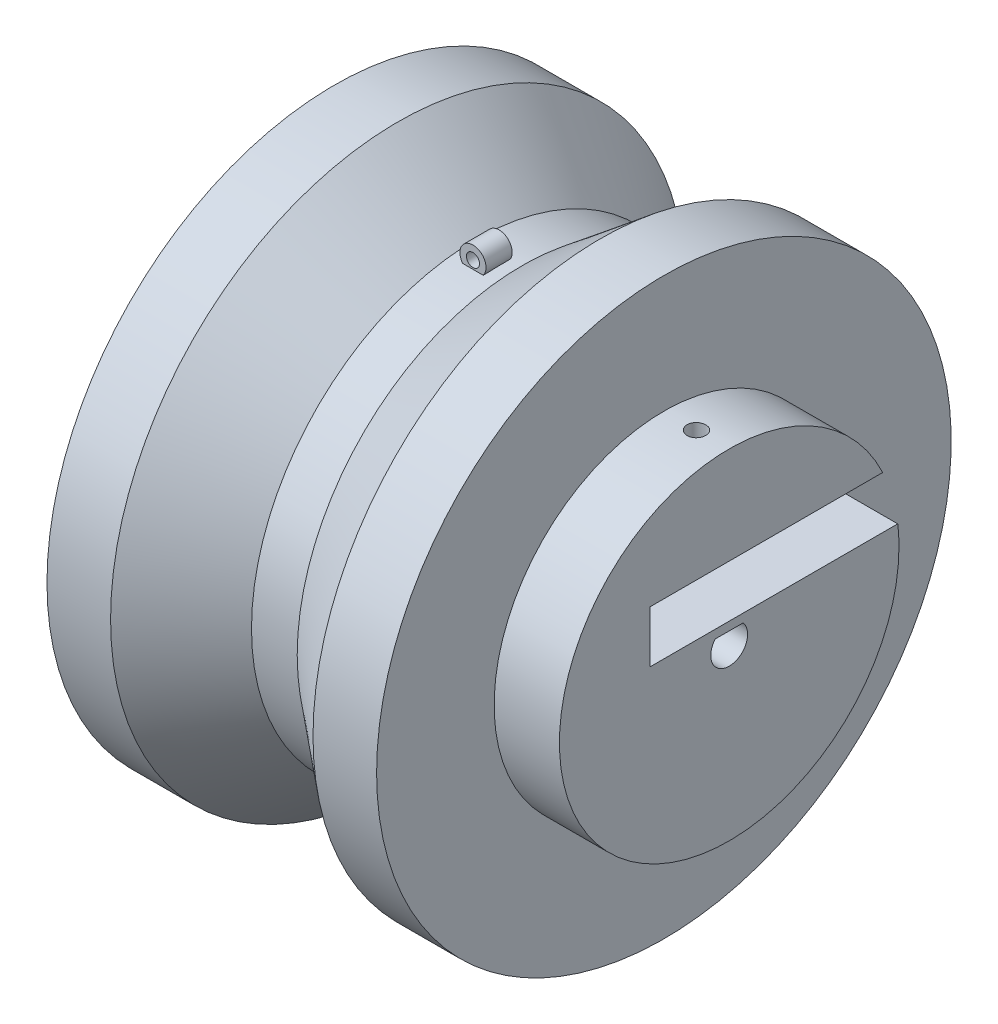
ISO-10303-21;
HEADER;
FILE_DESCRIPTION(('STEP AP214'),'2;1');
FILE_NAME('part.step','',(''),(''),'','','');
FILE_SCHEMA(('AUTOMOTIVE_DESIGN { 1 0 10303 214 1 1 1 1 }'));
ENDSEC;
DATA;
#1=APPLICATION_CONTEXT('core data for automotive mechanical design processes');
#2=APPLICATION_PROTOCOL_DEFINITION('international standard','automotive_design',2000,#1);
#3=PRODUCT_CONTEXT('',#1,'mechanical');
#4=PRODUCT('Part','Part','',(#3));
#5=PRODUCT_RELATED_PRODUCT_CATEGORY('part','',(#4));
#6=PRODUCT_DEFINITION_FORMATION('','',#4);
#7=PRODUCT_DEFINITION_CONTEXT('part definition',#1,'design');
#8=PRODUCT_DEFINITION('design','',#6,#7);
#9=PRODUCT_DEFINITION_SHAPE('','',#8);
#10=(LENGTH_UNIT() NAMED_UNIT(*) SI_UNIT(.MILLI.,.METRE.));
#11=(NAMED_UNIT(*) PLANE_ANGLE_UNIT() SI_UNIT($,.RADIAN.));
#12=(NAMED_UNIT(*) SI_UNIT($,.STERADIAN.) SOLID_ANGLE_UNIT());
#13=UNCERTAINTY_MEASURE_WITH_UNIT(LENGTH_MEASURE(1.E-05),#10,'distance_accuracy_value','');
#14=(GEOMETRIC_REPRESENTATION_CONTEXT(3) GLOBAL_UNCERTAINTY_ASSIGNED_CONTEXT((#13)) GLOBAL_UNIT_ASSIGNED_CONTEXT((#10,
#11,#12)) REPRESENTATION_CONTEXT('',''));
#15=CARTESIAN_POINT('',(0.,0.,0.));
#16=DIRECTION('',(0.,0.,1.));
#17=DIRECTION('',(1.,0.,0.));
#18=AXIS2_PLACEMENT_3D('',#15,#16,#17);
#19=CARTESIAN_POINT('',(-743.156397809563,0.,0.));
#20=DIRECTION('',(-1.,0.,0.));
#21=DIRECTION('',(0.,0.,1.));
#22=AXIS2_PLACEMENT_3D('',#19,#20,#21);
#23=CYLINDRICAL_SURFACE('',#22,34.4188584474886);
#24=CARTESIAN_POINT('',(28.74,0.,0.));
#25=DIRECTION('',(-1.,0.,0.));
#26=DIRECTION('',(0.,0.,1.));
#27=AXIS2_PLACEMENT_3D('',#24,#25,#26);
#28=CIRCLE('',#27,34.4188584474886);
#29=CARTESIAN_POINT('',(28.74,0.,34.4188584474886));
#30=VERTEX_POINT('',#29);
#31=EDGE_CURVE('E344',#30,#30,#28,.T.);
#32=ORIENTED_EDGE('',*,*,#31,.T.);
#33=EDGE_LOOP('',(#32));
#34=FACE_BOUND('',#33,.T.);
#35=CARTESIAN_POINT('',(21.74,0.,0.));
#36=DIRECTION('',(-1.,0.,0.));
#37=DIRECTION('',(0.,0.,1.));
#38=AXIS2_PLACEMENT_3D('',#35,#36,#37);
#39=CIRCLE('',#38,34.4188584474886);
#40=CARTESIAN_POINT('',(21.74,0.,34.4188584474886));
#41=VERTEX_POINT('',#40);
#42=EDGE_CURVE('E346',#41,#41,#39,.T.);
#43=ORIENTED_EDGE('',*,*,#42,.F.);
#44=EDGE_LOOP('',(#43));
#45=FACE_BOUND('',#44,.T.);
#46=CARTESIAN_POINT('',(26.8145368508783,34.1856375811284,4.00000000000001));
#47=CARTESIAN_POINT('',(26.82968944652,34.2050075026783,3.83446302633611));
#48=CARTESIAN_POINT('',(26.8433714607588,34.2231883782202,3.66865910863711));
#49=CARTESIAN_POINT('',(26.8681583997982,34.2571539669278,3.3366231559333));
#50=CARTESIAN_POINT('',(26.8792634822957,34.2729388266986,3.17039114775553));
#51=CARTESIAN_POINT('',(26.8992492378148,34.3020775033877,2.83780347960924));
#52=CARTESIAN_POINT('',(26.9081328188872,34.315434492178,2.67144827024622));
#53=CARTESIAN_POINT('',(26.9239526754156,34.3397327837103,2.33846925731088));
#54=CARTESIAN_POINT('',(26.9308889162202,34.3506740434655,2.17184544901209));
#55=CARTESIAN_POINT('',(26.9491009605565,34.3798606451544,1.67168588093801));
#56=CARTESIAN_POINT('',(26.9577818912487,34.3944715702011,1.33783048083154));
#57=CARTESIAN_POINT('',(26.9663855325016,34.409097380851,0.836563122496986));
#58=CARTESIAN_POINT('',(26.9685170638367,34.4127575582777,0.669279518658225));
#59=CARTESIAN_POINT('',(26.9713472850356,34.4176380646348,0.334665552754383));
#60=CARTESIAN_POINT('',(26.9720459835598,34.4188584083122,0.167335190978032));
#61=CARTESIAN_POINT('',(26.9720508075689,34.4188584474886,0.));
#62=B_SPLINE_CURVE_WITH_KNOTS('',3,(#46,#47,#48,#49,#50,#51,#52,#53,#54,#55,#56,#57,#58,#59,#60,
#61),.UNSPECIFIED.,.F.,.F.,(4,2,2,2,2,2,2,4),(0.,0.502040489258942,1.00405024775464,
1.50539937048782,2.0067574137914,3.00937854573099,3.51137142818393,4.01336127646227),.UNSPECIFIED.);
#63=CARTESIAN_POINT('',(26.8145368508783,34.1856375811284,4.00000000000001));
#64=VERTEX_POINT('',#63);
#65=CARTESIAN_POINT('',(26.9720508075689,34.4188584474886,0.));
#66=VERTEX_POINT('',#65);
#67=EDGE_CURVE('E52',#64,#66,#62,.T.);
#68=ORIENTED_EDGE('',*,*,#67,.F.);
#69=DIRECTION('',(-1.,0.,0.));
#70=VECTOR('',#69,1.);
#71=CARTESIAN_POINT('',(-743.156397809563,34.1856375811284,4.00000000000001));
#72=LINE('',#71,#70);
#73=CARTESIAN_POINT('',(23.6654631491217,34.1856375811284,4.00000000000001));
#74=VERTEX_POINT('',#73);
#75=EDGE_CURVE('E264',#64,#74,#72,.T.);
#76=ORIENTED_EDGE('',*,*,#75,.T.);
#77=CARTESIAN_POINT('',(23.5079491924311,34.4188584474886,0.));
#78=CARTESIAN_POINT('',(23.5079540164402,34.4188584083122,0.16733519097803));
#79=CARTESIAN_POINT('',(23.5086527149644,34.4176380646348,0.334665552754382));
#80=CARTESIAN_POINT('',(23.5114829361633,34.4127575582777,0.669279518658225));
#81=CARTESIAN_POINT('',(23.5136144674983,34.409097380851,0.836563122496985));
#82=CARTESIAN_POINT('',(23.5222181087513,34.3944715702011,1.33783048083154));
#83=CARTESIAN_POINT('',(23.5308990394434,34.3798606451544,1.67168588093801));
#84=CARTESIAN_POINT('',(23.5491110837798,34.3506740434655,2.17184544901208));
#85=CARTESIAN_POINT('',(23.5560473245843,34.3397327837103,2.33846925731087));
#86=CARTESIAN_POINT('',(23.5718671811127,34.315434492178,2.67144827024622));
#87=CARTESIAN_POINT('',(23.5807507621851,34.3020775033877,2.83780347960924));
#88=CARTESIAN_POINT('',(23.6007365177043,34.2729388266986,3.17039114775553));
#89=CARTESIAN_POINT('',(23.6118416002017,34.2571539669278,3.3366231559333));
#90=CARTESIAN_POINT('',(23.6366285392412,34.2231883782202,3.66865910863711));
#91=CARTESIAN_POINT('',(23.6503105534799,34.2050075026783,3.83446302633611));
#92=CARTESIAN_POINT('',(23.6654631491217,34.1856375811284,4.00000000000001));
#93=B_SPLINE_CURVE_WITH_KNOTS('',3,(#77,#78,#79,#80,#81,#82,#83,#84,#85,#86,#87,#88,#89,#90,#91,
#92),.UNSPECIFIED.,.F.,.F.,(4,2,2,2,2,2,2,4),(0.,0.501989848278344,1.00398273073128,
2.00660386267087,2.50796190597445,3.00931102870763,3.51132078720333,4.01336127646227),.UNSPECIFIED.);
#94=CARTESIAN_POINT('',(23.5079491924311,34.4188584474886,0.));
#95=VERTEX_POINT('',#94);
#96=EDGE_CURVE('E252',#95,#74,#93,.T.);
#97=ORIENTED_EDGE('',*,*,#96,.F.);
#98=DIRECTION('',(-1.,0.,0.));
#99=VECTOR('',#98,1.);
#100=CARTESIAN_POINT('',(-743.156397809563,34.4188584474886,0.));
#101=LINE('',#100,#99);
#102=CARTESIAN_POINT('',(25.24,34.4188584474886,0.));
#103=VERTEX_POINT('',#102);
#104=EDGE_CURVE('E375',#103,#95,#101,.T.);
#105=ORIENTED_EDGE('',*,*,#104,.F.);
#106=EDGE_CURVE('E378',#66,#103,#101,.T.);
#107=ORIENTED_EDGE('',*,*,#106,.F.);
#108=EDGE_LOOP('',(#68,#76,#97,#105,#107));
#109=FACE_BOUND('',#108,.T.);
#110=ADVANCED_FACE('F44',(#34,#45,#109),#23,.T.);
#111=CARTESIAN_POINT('',(0.,0.,0.));
#112=DIRECTION('',(1.,0.,0.));
#113=DIRECTION('',(0.,0.,-1.));
#114=AXIS2_PLACEMENT_3D('',#111,#112,#113);
#115=PLANE('',#114);
#116=CARTESIAN_POINT('',(0.,0.,0.));
#117=DIRECTION('',(-1.,0.,0.));
#118=DIRECTION('',(0.,0.,1.));
#119=AXIS2_PLACEMENT_3D('',#116,#117,#118);
#120=CIRCLE('',#119,44.);
#121=CARTESIAN_POINT('',(0.,0.,44.));
#122=VERTEX_POINT('',#121);
#123=EDGE_CURVE('E352',#122,#122,#120,.T.);
#124=ORIENTED_EDGE('',*,*,#123,.T.);
#125=EDGE_LOOP('',(#124));
#126=FACE_BOUND('',#125,.T.);
#127=ADVANCED_FACE('F46',(#126),#115,.F.);
#128=CARTESIAN_POINT('',(-743.156397809563,0.,0.));
#129=DIRECTION('',(-1.,0.,0.));
#130=DIRECTION('',(0.,0.,1.));
#131=AXIS2_PLACEMENT_3D('',#128,#129,#130);
#132=CYLINDRICAL_SURFACE('',#131,44.);
#133=ORIENTED_EDGE('',*,*,#123,.F.);
#134=EDGE_LOOP('',(#133));
#135=FACE_BOUND('',#134,.T.);
#136=CARTESIAN_POINT('',(9.73999999999997,0.,0.));
#137=DIRECTION('',(-1.,0.,0.));
#138=DIRECTION('',(0.,0.,1.));
#139=AXIS2_PLACEMENT_3D('',#136,#137,#138);
#140=CIRCLE('',#139,44.);
#141=CARTESIAN_POINT('',(9.73999999999997,0.,44.));
#142=VERTEX_POINT('',#141);
#143=EDGE_CURVE('E349',#142,#142,#140,.T.);
#144=ORIENTED_EDGE('',*,*,#143,.T.);
#145=EDGE_LOOP('',(#144));
#146=FACE_BOUND('',#145,.T.);
#147=ADVANCED_FACE('F240',(#135,#146),#132,.T.);
#148=CARTESIAN_POINT('',(21.74,0.,0.));
#149=DIRECTION('',(-1.,0.,0.));
#150=DIRECTION('',(0.,0.,1.));
#151=AXIS2_PLACEMENT_3D('',#148,#149,#150);
#152=CONICAL_SURFACE('',#151,34.4188584474886,0.673781952907129);
#153=ORIENTED_EDGE('',*,*,#143,.F.);
#154=EDGE_LOOP('',(#153));
#155=FACE_BOUND('',#154,.T.);
#156=ORIENTED_EDGE('',*,*,#42,.T.);
#157=EDGE_LOOP('',(#156));
#158=FACE_BOUND('',#157,.T.);
#159=ADVANCED_FACE('F249',(#155,#158),#152,.T.);
#160=CARTESIAN_POINT('',(40.74,0.,0.));
#161=DIRECTION('',(1.,0.,0.));
#162=DIRECTION('',(0.,0.,-1.));
#163=AXIS2_PLACEMENT_3D('',#160,#161,#162);
#164=CONICAL_SURFACE('',#163,44.,0.67378195290713);
#165=ORIENTED_EDGE('',*,*,#31,.F.);
#166=EDGE_LOOP('',(#165));
#167=FACE_BOUND('',#166,.T.);
#168=CARTESIAN_POINT('',(40.74,0.,0.));
#169=DIRECTION('',(-1.,0.,0.));
#170=DIRECTION('',(0.,0.,1.));
#171=AXIS2_PLACEMENT_3D('',#168,#169,#170);
#172=CIRCLE('',#171,44.);
#173=CARTESIAN_POINT('',(40.74,0.,44.));
#174=VERTEX_POINT('',#173);
#175=EDGE_CURVE('E341',#174,#174,#172,.T.);
#176=ORIENTED_EDGE('',*,*,#175,.T.);
#177=EDGE_LOOP('',(#176));
#178=FACE_BOUND('',#177,.T.);
#179=ADVANCED_FACE('F247',(#167,#178),#164,.T.);
#180=CARTESIAN_POINT('',(-743.156397809563,0.,0.));
#181=DIRECTION('',(-1.,0.,0.));
#182=DIRECTION('',(0.,0.,1.));
#183=AXIS2_PLACEMENT_3D('',#180,#181,#182);
#184=CYLINDRICAL_SURFACE('',#183,44.);
#185=ORIENTED_EDGE('',*,*,#175,.F.);
#186=EDGE_LOOP('',(#185));
#187=FACE_BOUND('',#186,.T.);
#188=CARTESIAN_POINT('',(50.48,0.,0.));
#189=DIRECTION('',(-1.,0.,0.));
#190=DIRECTION('',(0.,0.,1.));
#191=AXIS2_PLACEMENT_3D('',#188,#189,#190);
#192=CIRCLE('',#191,44.);
#193=CARTESIAN_POINT('',(50.48,0.,44.));
#194=VERTEX_POINT('',#193);
#195=EDGE_CURVE('E337',#194,#194,#192,.T.);
#196=ORIENTED_EDGE('',*,*,#195,.T.);
#197=EDGE_LOOP('',(#196));
#198=FACE_BOUND('',#197,.T.);
#199=ADVANCED_FACE('F400',(#187,#198),#184,.T.);
#200=CARTESIAN_POINT('',(50.48,44.,0.));
#201=DIRECTION('',(-1.,0.,0.));
#202=DIRECTION('',(0.,0.,1.));
#203=AXIS2_PLACEMENT_3D('',#200,#201,#202);
#204=PLANE('',#203);
#205=ORIENTED_EDGE('',*,*,#195,.F.);
#206=EDGE_LOOP('',(#205));
#207=FACE_BOUND('',#206,.T.);
#208=CARTESIAN_POINT('',(50.48,0.,0.));
#209=DIRECTION('',(1.,0.,0.));
#210=DIRECTION('',(0.,0.,-1.));
#211=AXIS2_PLACEMENT_3D('',#208,#209,#210);
#212=CIRCLE('',#211,26.);
#213=CARTESIAN_POINT('',(50.48,0.,-26.));
#214=VERTEX_POINT('',#213);
#215=EDGE_CURVE('E149',#214,#214,#212,.T.);
#216=ORIENTED_EDGE('',*,*,#215,.F.);
#217=EDGE_LOOP('',(#216));
#218=FACE_BOUND('',#217,.T.);
#219=ADVANCED_FACE('F279',(#207,#218),#204,.F.);
#220=CARTESIAN_POINT('',(25.24,35.4188584474886,4.00000000000001));
#221=DIRECTION('',(0.,0.,1.));
#222=DIRECTION('',(1.,0.,0.));
#223=AXIS2_PLACEMENT_3D('',#220,#221,#222);
#224=PLANE('',#223);
#225=CARTESIAN_POINT('',(25.24,35.4188584474886,4.00000000000001));
#226=DIRECTION('',(0.,0.,1.));
#227=DIRECTION('',(1.,0.,0.));
#228=AXIS2_PLACEMENT_3D('',#225,#226,#227);
#229=CIRCLE('',#228,1.);
#230=CARTESIAN_POINT('',(26.24,35.4188584474886,4.00000000000001));
#231=VERTEX_POINT('',#230);
#232=EDGE_CURVE('E161',#231,#231,#229,.T.);
#233=ORIENTED_EDGE('',*,*,#232,.F.);
#234=EDGE_LOOP('',(#233));
#235=FACE_BOUND('',#234,.T.);
#236=ORIENTED_EDGE('',*,*,#75,.F.);
#237=CARTESIAN_POINT('',(25.24,35.4188584474886,4.00000000000001));
#238=DIRECTION('',(0.,0.,1.));
#239=DIRECTION('',(1.,0.,0.));
#240=AXIS2_PLACEMENT_3D('',#237,#238,#239);
#241=CIRCLE('',#240,2.);
#242=EDGE_CURVE('E168',#64,#74,#241,.T.);
#243=ORIENTED_EDGE('',*,*,#242,.T.);
#244=EDGE_LOOP('',(#236,#243));
#245=FACE_BOUND('',#244,.T.);
#246=ADVANCED_FACE('F275',(#235,#245),#224,.T.);
#247=CARTESIAN_POINT('',(25.24,35.4188584474886,0.));
#248=DIRECTION('',(0.,0.,1.));
#249=DIRECTION('',(1.,0.,0.));
#250=AXIS2_PLACEMENT_3D('',#247,#248,#249);
#251=PLANE('',#250);
#252=CARTESIAN_POINT('',(25.24,35.4188584474886,0.));
#253=DIRECTION('',(0.,0.,1.));
#254=DIRECTION('',(1.,0.,0.));
#255=AXIS2_PLACEMENT_3D('',#252,#253,#254);
#256=CIRCLE('',#255,2.);
#257=EDGE_CURVE('E164',#66,#95,#256,.T.);
#258=ORIENTED_EDGE('',*,*,#257,.F.);
#259=ORIENTED_EDGE('',*,*,#106,.T.);
#260=CARTESIAN_POINT('',(25.24,35.4188584474886,0.));
#261=DIRECTION('',(0.,0.,1.));
#262=DIRECTION('',(1.,0.,0.));
#263=AXIS2_PLACEMENT_3D('',#260,#261,#262);
#264=CIRCLE('',#263,1.);
#265=EDGE_CURVE('E165',#103,#103,#264,.T.);
#266=ORIENTED_EDGE('',*,*,#265,.T.);
#267=ORIENTED_EDGE('',*,*,#104,.T.);
#268=EDGE_LOOP('',(#258,#259,#266,#267));
#269=FACE_BOUND('',#268,.T.);
#270=ADVANCED_FACE('F270',(#269),#251,.F.);
#271=CARTESIAN_POINT('',(25.24,35.4188584474886,4.00000000000001));
#272=DIRECTION('',(0.,0.,-1.));
#273=DIRECTION('',(-1.,0.,0.));
#274=AXIS2_PLACEMENT_3D('',#271,#272,#273);
#275=CYLINDRICAL_SURFACE('',#274,2.);
#276=ORIENTED_EDGE('',*,*,#242,.F.);
#277=ORIENTED_EDGE('',*,*,#67,.T.);
#278=ORIENTED_EDGE('',*,*,#257,.T.);
#279=ORIENTED_EDGE('',*,*,#96,.T.);
#280=EDGE_LOOP('',(#276,#277,#278,#279));
#281=FACE_BOUND('',#280,.T.);
#282=ADVANCED_FACE('F265',(#281),#275,.T.);
#283=CARTESIAN_POINT('',(25.24,35.4188584474886,4.00000000000001));
#284=DIRECTION('',(0.,0.,-1.));
#285=DIRECTION('',(-1.,0.,0.));
#286=AXIS2_PLACEMENT_3D('',#283,#284,#285);
#287=CYLINDRICAL_SURFACE('',#286,1.);
#288=ORIENTED_EDGE('',*,*,#232,.T.);
#289=EDGE_LOOP('',(#288));
#290=FACE_BOUND('',#289,.T.);
#291=ORIENTED_EDGE('',*,*,#265,.F.);
#292=EDGE_LOOP('',(#291));
#293=FACE_BOUND('',#292,.T.);
#294=ADVANCED_FACE('F269',(#290,#293),#287,.F.);
#295=CARTESIAN_POINT('',(50.48,0.,0.));
#296=DIRECTION('',(1.,0.,0.));
#297=DIRECTION('',(0.,0.,-1.));
#298=AXIS2_PLACEMENT_3D('',#295,#296,#297);
#299=CYLINDRICAL_SURFACE('',#298,26.);
#300=ORIENTED_EDGE('',*,*,#215,.T.);
#301=EDGE_LOOP('',(#300));
#302=FACE_BOUND('',#301,.T.);
#303=DIRECTION('',(1.,0.,0.));
#304=VECTOR('',#303,1.);
#305=CARTESIAN_POINT('',(50.48,11.1091970832048,-23.5071423224201));
#306=LINE('',#305,#304);
#307=CARTESIAN_POINT('',(60.48,11.1091970832048,-23.5071423224201));
#308=VERTEX_POINT('',#307);
#309=CARTESIAN_POINT('',(51.48,11.1091970832048,-23.5071423224201));
#310=VERTEX_POINT('',#309);
#311=EDGE_CURVE('E298',#308,#310,#306,.F.);
#312=ORIENTED_EDGE('',*,*,#311,.T.);
#313=CARTESIAN_POINT('',(51.48,0.,0.));
#314=DIRECTION('',(1.,0.,0.));
#315=DIRECTION('',(0.,0.,-1.));
#316=AXIS2_PLACEMENT_3D('',#313,#314,#315);
#317=CIRCLE('',#316,26.);
#318=CARTESIAN_POINT('',(51.48,3.14851909053575,-25.808657995652));
#319=VERTEX_POINT('',#318);
#320=EDGE_CURVE('E59',#319,#310,#317,.T.);
#321=ORIENTED_EDGE('',*,*,#320,.F.);
#322=DIRECTION('',(1.,0.,0.));
#323=VECTOR('',#322,1.);
#324=CARTESIAN_POINT('',(50.48,3.14851909053575,-25.808657995652));
#325=LINE('',#324,#323);
#326=CARTESIAN_POINT('',(60.48,3.14851909053575,-25.808657995652));
#327=VERTEX_POINT('',#326);
#328=EDGE_CURVE('E12',#327,#319,#325,.F.);
#329=ORIENTED_EDGE('',*,*,#328,.F.);
#330=CARTESIAN_POINT('',(60.48,0.,0.));
#331=DIRECTION('',(1.,0.,0.));
#332=DIRECTION('',(0.,0.,-1.));
#333=AXIS2_PLACEMENT_3D('',#330,#331,#332);
#334=CIRCLE('',#333,26.);
#335=EDGE_CURVE('E135',#308,#327,#334,.T.);
#336=ORIENTED_EDGE('',*,*,#335,.F.);
#337=EDGE_LOOP('',(#312,#321,#329,#336));
#338=FACE_BOUND('',#337,.T.);
#339=CARTESIAN_POINT('',(55.4799999999999,25.9606452154025,1.43));
#340=CARTESIAN_POINT('',(55.3997414745969,25.9606457432606,1.42999646174459));
#341=CARTESIAN_POINT('',(55.3194263007213,25.9610214009006,1.42322055607483));
#342=CARTESIAN_POINT('',(55.1610123488694,25.9624836725149,1.39628665906067));
#343=CARTESIAN_POINT('',(55.0829162827062,25.9635711203589,1.37611297166748));
#344=CARTESIAN_POINT('',(54.9312582060602,25.9663334231423,1.32296355687126));
#345=CARTESIAN_POINT('',(54.8576938763382,25.9680079746293,1.28999444201665));
#346=CARTESIAN_POINT('',(54.7171631862243,25.9717554149124,1.21220040305273));
#347=CARTESIAN_POINT('',(54.6501952908242,25.9738282107032,1.16737824616643));
#348=CARTESIAN_POINT('',(54.5246587044569,25.9781413981463,1.06709120947127));
#349=CARTESIAN_POINT('',(54.4660989065364,25.98038196349,1.01161520415814));
#350=CARTESIAN_POINT('',(54.3591167580755,25.9847765964923,0.891617792982238));
#351=CARTESIAN_POINT('',(54.3106948246885,25.9869306605886,0.827096015085937));
#352=CARTESIAN_POINT('',(54.2253372745588,25.9909109680766,0.690790548009691));
#353=CARTESIAN_POINT('',(54.1884087588658,25.99273700851,0.619002405556015));
#354=CARTESIAN_POINT('',(54.1271318366663,25.9958537162177,0.470233316464185));
#355=CARTESIAN_POINT('',(54.1027833202381,25.9971443881699,0.393252415206035));
#356=CARTESIAN_POINT('',(54.0673815313131,25.999043742903,0.236366399038098));
#357=CARTESIAN_POINT('',(54.0563147000777,25.9996531211456,0.156464352249641));
#358=CARTESIAN_POINT('',(54.0477485736116,26.0001235570742,-0.00406548311599145));
#359=CARTESIAN_POINT('',(54.0502491543677,25.9999846216002,-0.0846932650528494));
#360=CARTESIAN_POINT('',(54.0687356449108,25.9989746695871,-0.244294024405638));
#361=CARTESIAN_POINT('',(54.0847069645026,25.9981044451129,-0.323268697503819));
#362=CARTESIAN_POINT('',(54.129658939239,25.995730829767,-0.47741439178013));
#363=CARTESIAN_POINT('',(54.1586396573242,25.9942274358319,-0.552585394553836));
#364=CARTESIAN_POINT('',(54.2288043661014,25.9907554367137,-0.697036848106606));
#365=CARTESIAN_POINT('',(54.2699949911395,25.9887865787351,-0.766314070048916));
#366=CARTESIAN_POINT('',(54.3634054259185,25.9846053215693,-0.896976157379153));
#367=CARTESIAN_POINT('',(54.4156253308127,25.982392920281,-0.958360954669188));
#368=CARTESIAN_POINT('',(54.5296944459544,25.977970207943,-1.07158082016811));
#369=CARTESIAN_POINT('',(54.5915563164515,25.9757599035412,-1.12340313427972));
#370=CARTESIAN_POINT('',(54.7231089012749,25.9715935088527,-1.21592870499442));
#371=CARTESIAN_POINT('',(54.7927996180305,25.9696374186449,-1.25663195814722));
#372=CARTESIAN_POINT('',(54.9380394833157,25.9662002709051,-1.32576295456957));
#373=CARTESIAN_POINT('',(55.0135888708459,25.9647192327652,-1.35419019673649));
#374=CARTESIAN_POINT('',(55.1683979426359,25.9623999298447,-1.39795360067068));
#375=CARTESIAN_POINT('',(55.2476575931184,25.9615616592137,-1.4132898815907));
#376=CARTESIAN_POINT('',(55.4075261428654,25.9606235118645,-1.43042020493149));
#377=CARTESIAN_POINT('',(55.4881331388122,25.9605226693909,-1.4322319594957));
#378=CARTESIAN_POINT('',(55.6485059545181,25.9610682286136,-1.4223080438512));
#379=CARTESIAN_POINT('',(55.7282717776525,25.9617146273105,-1.41057242802236));
#380=CARTESIAN_POINT('',(55.8846481118451,25.9636809357888,-1.37390160134515));
#381=CARTESIAN_POINT('',(55.9612605341028,25.9650004309286,-1.34897451636884));
#382=CARTESIAN_POINT('',(56.1092142398783,25.9681638692744,-1.28663656578129));
#383=CARTESIAN_POINT('',(56.1805554864088,25.97000781616,-1.24922561258226));
#384=CARTESIAN_POINT('',(56.3160231648039,25.9740146881829,-1.16293649963386));
#385=CARTESIAN_POINT('',(56.3801420152935,25.9761779430976,-1.11404645320808));
#386=CARTESIAN_POINT('',(56.4992685001231,25.9805784677071,-1.0062043039687));
#387=CARTESIAN_POINT('',(56.5542760646679,25.9828157379686,-0.947252124083008));
#388=CARTESIAN_POINT('',(56.6536781506662,25.9871149733113,-0.82088301017176));
#389=CARTESIAN_POINT('',(56.6980612234944,25.9891767477561,-0.753457063282263));
#390=CARTESIAN_POINT('',(56.7748761605986,25.9928899127628,-0.612099857401339));
#391=CARTESIAN_POINT('',(56.8073080850304,25.9945413053904,-0.538168631156383));
#392=CARTESIAN_POINT('',(56.8592801214599,25.9972466973768,-0.385941904772132));
#393=CARTESIAN_POINT('',(56.8788275282194,25.9983010347197,-0.307648901397723));
#394=CARTESIAN_POINT('',(56.9044995330342,25.9996948468055,-0.148886206992932));
#395=CARTESIAN_POINT('',(56.9106242278413,26.0000343267012,-0.0684165316563695));
#396=CARTESIAN_POINT('',(56.9092760338414,25.9999601877807,0.0923017632783475));
#397=CARTESIAN_POINT('',(56.9018210871787,25.9995475626851,0.172550534462249));
#398=CARTESIAN_POINT('',(56.8735623610373,25.9980176107033,0.33065522813357));
#399=CARTESIAN_POINT('',(56.8527585569802,25.9969002825195,0.408511146214914));
#400=CARTESIAN_POINT('',(56.7983964912508,25.9940865853372,0.55962340351444));
#401=CARTESIAN_POINT('',(56.7648381960357,25.9923902148161,0.632879730635657));
#402=CARTESIAN_POINT('',(56.6859225664552,25.9886090943445,0.772720078712738));
#403=CARTESIAN_POINT('',(56.6405655732653,25.9865243556249,0.839304292524666));
#404=CARTESIAN_POINT('',(56.5392748322516,25.9821978861198,0.964000613529038));
#405=CARTESIAN_POINT('',(56.4833283579038,25.9799559684979,1.02210237606249));
#406=CARTESIAN_POINT('',(56.3624593004149,25.9755691957916,1.12810805727267));
#407=CARTESIAN_POINT('',(56.2975345166262,25.9734243646755,1.17600946843714));
#408=CARTESIAN_POINT('',(56.1604921549641,25.9694720111554,1.26028199697523));
#409=CARTESIAN_POINT('',(56.088366997249,25.9676648500862,1.29664079154126));
#410=CARTESIAN_POINT('',(55.9390793548653,25.9645972008007,1.35668887339326));
#411=CARTESIAN_POINT('',(55.8619229223637,25.9633360692252,1.38039307866367));
#412=CARTESIAN_POINT('',(55.7335748498768,25.9618355569896,1.4082625634952));
#413=CARTESIAN_POINT('',(55.683213932339,25.9613911572328,1.41640364519113));
#414=CARTESIAN_POINT('',(55.5819096241043,25.9607958189919,1.42727348403843));
#415=CARTESIAN_POINT('',(55.5309662340202,25.960644880199,1.43000224688346));
#416=CARTESIAN_POINT('',(55.4799999999999,25.9606452154025,1.43));
#417=B_SPLINE_CURVE_WITH_KNOTS('',3,(#339,#340,#341,#342,#343,#344,#345,#346,#347,#348,#349,
#350,#351,#352,#353,#354,#355,#356,#357,#358,#359,#360,#361,#362,#363,#364,#365,#366,#367,#368,
#369,#370,#371,#372,#373,#374,#375,#376,#377,#378,#379,#380,#381,#382,#383,#384,#385,#386,#387,
#388,#389,#390,#391,#392,#393,#394,#395,#396,#397,#398,#399,#400,#401,#402,#403,#404,#405,#406,
#407,#408,#409,#410,#411,#412,#413,#414,#415,#416),.UNSPECIFIED.,.T.,.F.,(4,2,2,2,2,2,2,2,2,2,2,
2,2,2,2,2,2,2,2,2,2,2,2,2,2,2,2,2,2,2,2,2,2,2,2,2,2,2,4),(0.,0.240589525340981,0.48146140953237,
0.722208978953028,0.962900392750026,1.20384453393753,1.44479858755755,1.68590121714152,
1.92700173997999,2.16785592305028,2.40870790459317,2.64929935317269,2.88989196576574,
3.13061554657232,3.37134120426521,3.61238564840846,3.85343016734847,4.09448452471438,
4.33553668800175,4.57627310634767,4.81700855836801,5.05759589099824,5.29818491164332,
5.53902417117536,5.77986527552685,6.02096474623601,6.26206300336089,6.50302464159785,
6.7439845429626,6.98462630618951,7.22526851249512,7.46591135166523,7.70654723309587,
7.94747417033247,8.18846026549322,8.42970277702744,8.67066026597183,8.82344098165522,
8.97622153661579),.UNSPECIFIED.);
#418=CARTESIAN_POINT('',(55.4799999999999,25.9606452154025,1.43));
#419=VERTEX_POINT('',#418);
#420=EDGE_CURVE('E290',#419,#419,#417,.T.);
#421=ORIENTED_EDGE('',*,*,#420,.T.);
#422=EDGE_LOOP('',(#421));
#423=FACE_BOUND('',#422,.T.);
#424=ADVANCED_FACE('F133',(#302,#338,#423),#299,.T.);
#425=CARTESIAN_POINT('',(29.9566790366801,22.,0.));
#426=DIRECTION('',(0.,1.,0.));
#427=DIRECTION('',(0.,0.,1.));
#428=AXIS2_PLACEMENT_3D('',#425,#426,#427);
#429=PLANE('',#428);
#430=CARTESIAN_POINT('',(29.9566790366801,22.,0.));
#431=DIRECTION('',(0.,1.,0.));
#432=DIRECTION('',(0.,0.,1.));
#433=AXIS2_PLACEMENT_3D('',#430,#431,#432);
#434=CIRCLE('',#433,1.43);
#435=CARTESIAN_POINT('',(29.9566790366801,22.,1.43));
#436=VERTEX_POINT('',#435);
#437=EDGE_CURVE('E171',#436,#436,#434,.T.);
#438=ORIENTED_EDGE('',*,*,#437,.F.);
#439=EDGE_LOOP('',(#438));
#440=FACE_BOUND('',#439,.T.);
#441=ADVANCED_FACE('F199',(#440),#429,.F.);
#442=CARTESIAN_POINT('',(25.48,0.,0.));
#443=DIRECTION('',(1.,0.,0.));
#444=DIRECTION('',(0.,0.,-1.));
#445=AXIS2_PLACEMENT_3D('',#442,#443,#444);
#446=PLANE('',#445);
#447=CARTESIAN_POINT('',(25.48,0.,0.));
#448=DIRECTION('',(1.,0.,0.));
#449=DIRECTION('',(0.,0.,-1.));
#450=AXIS2_PLACEMENT_3D('',#447,#448,#449);
#451=CIRCLE('',#450,2.825);
#452=CARTESIAN_POINT('',(25.48,0.,-2.825));
#453=VERTEX_POINT('',#452);
#454=EDGE_CURVE('E335',#453,#453,#451,.T.);
#455=ORIENTED_EDGE('',*,*,#454,.T.);
#456=EDGE_LOOP('',(#455));
#457=FACE_BOUND('',#456,.T.);
#458=ADVANCED_FACE('F223',(#457),#446,.T.);
#459=CARTESIAN_POINT('',(30.48,0.,0.));
#460=DIRECTION('',(1.,0.,0.));
#461=DIRECTION('',(0.,0.,-1.));
#462=AXIS2_PLACEMENT_3D('',#459,#460,#461);
#463=PLANE('',#462);
#464=CARTESIAN_POINT('',(30.48,0.,0.));
#465=DIRECTION('',(1.,0.,0.));
#466=DIRECTION('',(0.,0.,-1.));
#467=AXIS2_PLACEMENT_3D('',#464,#465,#466);
#468=CIRCLE('',#467,2.825);
#469=CARTESIAN_POINT('',(30.48,1.85097792377277,2.13412879782497));
#470=VERTEX_POINT('',#469);
#471=CARTESIAN_POINT('',(30.48,2.49190485987127,1.33080245316498));
#472=VERTEX_POINT('',#471);
#473=EDGE_CURVE('E356',#470,#472,#468,.F.);
#474=ORIENTED_EDGE('',*,*,#473,.T.);
#475=DIRECTION('',(0.,1.,0.));
#476=VECTOR('',#475,1.);
#477=CARTESIAN_POINT('',(30.48,0.,1.33080245316498));
#478=LINE('',#477,#476);
#479=CARTESIAN_POINT('',(30.48,1.85097792377277,1.33080245316498));
#480=VERTEX_POINT('',#479);
#481=EDGE_CURVE('E366',#472,#480,#478,.F.);
#482=ORIENTED_EDGE('',*,*,#481,.T.);
#483=DIRECTION('',(0.,0.,-1.));
#484=VECTOR('',#483,1.);
#485=CARTESIAN_POINT('',(30.48,1.85097792377277,2.60998384332674));
#486=LINE('',#485,#484);
#487=EDGE_CURVE('E328',#470,#480,#486,.T.);
#488=ORIENTED_EDGE('',*,*,#487,.F.);
#489=EDGE_LOOP('',(#474,#482,#488));
#490=FACE_BOUND('',#489,.T.);
#491=ADVANCED_FACE('F220',(#490),#463,.F.);
#492=CARTESIAN_POINT('',(30.48,1.85097792377277,-1.33080245316498));
#493=VERTEX_POINT('',#492);
#494=CARTESIAN_POINT('',(30.48,1.85097792377277,-2.13412879782497));
#495=VERTEX_POINT('',#494);
#496=EDGE_CURVE('E332',#493,#495,#486,.T.);
#497=ORIENTED_EDGE('',*,*,#496,.F.);
#498=DIRECTION('',(0.,1.,0.));
#499=VECTOR('',#498,1.);
#500=CARTESIAN_POINT('',(30.48,0.,-1.33080245316498));
#501=LINE('',#500,#499);
#502=CARTESIAN_POINT('',(30.48,2.49190485987127,-1.33080245316498));
#503=VERTEX_POINT('',#502);
#504=EDGE_CURVE('E368',#493,#503,#501,.T.);
#505=ORIENTED_EDGE('',*,*,#504,.T.);
#506=EDGE_CURVE('E355',#503,#495,#468,.F.);
#507=ORIENTED_EDGE('',*,*,#506,.T.);
#508=EDGE_LOOP('',(#497,#505,#507));
#509=FACE_BOUND('',#508,.T.);
#510=ADVANCED_FACE('F197',(#509),#463,.F.);
#511=CARTESIAN_POINT('',(29.9566790366801,0.,0.));
#512=DIRECTION('',(0.,1.,0.));
#513=DIRECTION('',(0.,0.,1.));
#514=AXIS2_PLACEMENT_3D('',#511,#512,#513);
#515=CYLINDRICAL_SURFACE('',#514,1.43);
#516=ORIENTED_EDGE('',*,*,#437,.T.);
#517=EDGE_LOOP('',(#516));
#518=FACE_BOUND('',#517,.T.);
#519=CARTESIAN_POINT('',(29.9566790366801,1.85097792377277,0.));
#520=DIRECTION('',(0.,-1.,0.));
#521=DIRECTION('',(0.,0.,-1.));
#522=AXIS2_PLACEMENT_3D('',#519,#520,#521);
#523=CIRCLE('',#522,1.43);
#524=EDGE_CURVE('E176',#493,#480,#523,.T.);
#525=ORIENTED_EDGE('',*,*,#524,.T.);
#526=ORIENTED_EDGE('',*,*,#481,.F.);
#527=CARTESIAN_POINT('',(29.9566790366801,2.43633433666236,1.43));
#528=CARTESIAN_POINT('',(30.0310486062594,2.43634106256424,1.4299946856981));
#529=CARTESIAN_POINT('',(30.1055087973779,2.43979159128264,1.42415949216049));
#530=CARTESIAN_POINT('',(30.2521320810147,2.45308967408271,1.40112153379887));
#531=CARTESIAN_POINT('',(30.3242901487283,2.46295033451514,1.38389547762529));
#532=CARTESIAN_POINT('',(30.4639099415961,2.48763028839913,1.33901685793397));
#533=CARTESIAN_POINT('',(30.5313948166949,2.5024226549163,1.31142081235771));
#534=CARTESIAN_POINT('',(30.6607593367481,2.53525731015273,1.2467583422474));
#535=CARTESIAN_POINT('',(30.7226385596017,2.55329984330159,1.20969120534977));
#536=CARTESIAN_POINT('',(30.8448171358912,2.5924669935179,1.12346069596283));
#537=CARTESIAN_POINT('',(30.9045393200538,2.61372322307625,1.0735389716723));
#538=CARTESIAN_POINT('',(31.0152139941782,2.65586137739765,0.964592069370176));
#539=CARTESIAN_POINT('',(31.0661620154096,2.676743106604,0.905562281416003));
#540=CARTESIAN_POINT('',(31.1613112017384,2.71751497928665,0.77506253892183));
#541=CARTESIAN_POINT('',(31.2047971887977,2.73723529293328,0.703013066368646));
#542=CARTESIAN_POINT('',(31.2787668635834,2.7717445381839,0.551435514417819));
#543=CARTESIAN_POINT('',(31.3092589577614,2.78653665674786,0.471912310956026));
#544=CARTESIAN_POINT('',(31.3540720584115,2.8085727144986,0.313763966744014));
#545=CARTESIAN_POINT('',(31.3694066798502,2.81628682858994,0.235493055994554));
#546=CARTESIAN_POINT('',(31.3868128355241,2.82505708787646,0.0771390500952302));
#547=CARTESIAN_POINT('',(31.3888926256954,2.82611737748249,-0.00294288583094858));
#548=CARTESIAN_POINT('',(31.3801093140635,2.82167872089825,-0.155003173296772));
#549=CARTESIAN_POINT('',(31.370382606764,2.81675563007458,-0.227067949039157));
#550=CARTESIAN_POINT('',(31.3403032895575,2.80178002874723,-0.36837898486757));
#551=CARTESIAN_POINT('',(31.3199498827546,2.79172713356093,-0.437625033157438));
#552=CARTESIAN_POINT('',(31.2690767484212,2.76723879402554,-0.572522880617796));
#553=CARTESIAN_POINT('',(31.2384229790743,2.75274580113928,-0.638113249678675));
#554=CARTESIAN_POINT('',(31.1680117977919,2.72067465141874,-0.763374728906796));
#555=CARTESIAN_POINT('',(31.1282511555385,2.70309540036922,-0.823043727902392));
#556=CARTESIAN_POINT('',(31.0363631842388,2.66449623283134,-0.940898542147452));
#557=CARTESIAN_POINT('',(30.9834139203771,2.64330800773995,-0.998388861362848));
#558=CARTESIAN_POINT('',(30.8688444394389,2.60094926365108,-1.10405392939122));
#559=CARTESIAN_POINT('',(30.8072173307328,2.57977877231139,-1.15222120127484));
#560=CARTESIAN_POINT('',(30.6720510116335,2.53832230491392,-1.24100914161181));
#561=CARTESIAN_POINT('',(30.5979929712191,2.51818798312747,-1.28091792306681));
#562=CARTESIAN_POINT('',(30.4429653170786,2.48325002785476,-1.34741192514363));
#563=CARTESIAN_POINT('',(30.3620031637716,2.46844072835759,-1.37401131929604));
#564=CARTESIAN_POINT('',(30.2022495988668,2.44750464735918,-1.41094524081496));
#565=CARTESIAN_POINT('',(30.1238007608435,2.4407791728384,-1.42240857399515));
#566=CARTESIAN_POINT('',(29.9658316610572,2.43507691790079,-1.43215397931822));
#567=CARTESIAN_POINT('',(29.8863122454119,2.43609434001436,-1.43044591349213));
#568=CARTESIAN_POINT('',(29.7380905594827,2.44512708439552,-1.41493316724195));
#569=CARTESIAN_POINT('',(29.6691847949259,2.45233517551116,-1.40252321935648));
#570=CARTESIAN_POINT('',(29.5345718886026,2.47173165308524,-1.36804817821965));
#571=CARTESIAN_POINT('',(29.4688658247343,2.48392170502796,-1.34597985597009));
#572=CARTESIAN_POINT('',(29.3390603800186,2.51256412459342,-1.29175226860914));
#573=CARTESIAN_POINT('',(29.2751749945697,2.52918719646903,-1.25917440813694));
#574=CARTESIAN_POINT('',(29.1534055680163,2.56467815809878,-1.18521421663262));
#575=CARTESIAN_POINT('',(29.0955246396997,2.58354720141674,-1.14382735249154));
#576=CARTESIAN_POINT('',(28.9795424067414,2.624347708235,-1.04714739104825));
#577=CARTESIAN_POINT('',(28.9223882612274,2.64635869506766,-0.990746427622596));
#578=CARTESIAN_POINT('',(28.8180484761116,2.68885330963484,-0.868826875058145));
#579=CARTESIAN_POINT('',(28.7708664745375,2.70933637819844,-0.803304972836588));
#580=CARTESIAN_POINT('',(28.6866375175714,2.74723012607855,-0.662432335028988));
#581=CARTESIAN_POINT('',(28.649923339626,2.76453475089508,-0.586852051117545));
#582=CARTESIAN_POINT('',(28.590101580797,2.79330747056428,-0.429459850422707));
#583=CARTESIAN_POINT('',(28.5669817626428,2.80478081331157,-0.347653613238622));
#584=CARTESIAN_POINT('',(28.5370432200879,2.81974140835355,-0.188359085791952));
#585=CARTESIAN_POINT('',(28.5289063387642,2.82387316717914,-0.111178695651105));
#586=CARTESIAN_POINT('',(28.5252515314317,2.82572202216662,0.0435458425940389));
#587=CARTESIAN_POINT('',(28.5297289576895,2.82344148093692,0.121089846214605));
#588=CARTESIAN_POINT('',(28.5503154816636,2.8130969150554,0.268731662233294));
#589=CARTESIAN_POINT('',(28.5656055999002,2.80544035766814,0.338975370567526));
#590=CARTESIAN_POINT('',(28.606260977793,2.78550550337869,0.475778813162854));
#591=CARTESIAN_POINT('',(28.6316276485791,2.77322655916573,0.542338029956231));
#592=CARTESIAN_POINT('',(28.692815017981,2.74450683391049,0.673032712672934));
#593=CARTESIAN_POINT('',(28.7290302422958,2.72791283930445,0.736948774746347));
#594=CARTESIAN_POINT('',(28.8103947927032,2.69227701645913,0.858056533851876));
#595=CARTESIAN_POINT('',(28.8555482001769,2.67323407136927,0.915245139882386));
#596=CARTESIAN_POINT('',(28.958821719056,2.63229417195532,1.02740849371257));
#597=CARTESIAN_POINT('',(29.0177933670592,2.61030388079156,1.08156718366022));
#598=CARTESIAN_POINT('',(29.1442740169538,2.56752569223307,1.1795345223554));
#599=CARTESIAN_POINT('',(29.2117908127654,2.54673891810032,1.2233336162816));
#600=CARTESIAN_POINT('',(29.3565819319208,2.50814781524904,1.30067562779219));
#601=CARTESIAN_POINT('',(29.4341173451936,2.49047536759027,1.33379982980793));
#602=CARTESIAN_POINT('',(29.5948088891815,2.4618088753392,1.38601277699976));
#603=CARTESIAN_POINT('',(29.677945234109,2.45079256430642,1.40514836319815));
#604=CARTESIAN_POINT('',(29.7944673582709,2.44151495102919,1.42114300821465));
#605=CARTESIAN_POINT('',(29.8267831765326,2.43957950148433,1.42445893520494));
#606=CARTESIAN_POINT('',(29.8916198839309,2.4369876799413,1.42888866768421));
#607=CARTESIAN_POINT('',(29.9241407867076,2.4363313939389,1.43000232511879));
#608=CARTESIAN_POINT('',(29.9566790366801,2.43633433666236,1.43));
#609=B_SPLINE_CURVE_WITH_KNOTS('',3,(#527,#528,#529,#530,#531,#532,#533,#534,#535,#536,#537,
#538,#539,#540,#541,#542,#543,#544,#545,#546,#547,#548,#549,#550,#551,#552,#553,#554,#555,#556,
#557,#558,#559,#560,#561,#562,#563,#564,#565,#566,#567,#568,#569,#570,#571,#572,#573,#574,#575,
#576,#577,#578,#579,#580,#581,#582,#583,#584,#585,#586,#587,#588,#589,#590,#591,#592,#593,#594,
#595,#596,#597,#598,#599,#600,#601,#602,#603,#604,#605,#606,#607,#608),.UNSPECIFIED.,.T.,.F.,(4,
2,2,2,2,2,2,2,2,2,2,2,2,2,2,2,2,2,2,2,2,2,2,2,2,2,2,2,2,2,2,2,2,2,2,2,2,2,2,2,4),(0.,
0.222971705040798,0.446400744846071,0.668629321132849,0.890874617158091,1.13193353374815,
1.37311486222965,1.63106142972947,1.88884086336202,2.12789869378702,2.36680760951089,
2.58443555782147,2.80207982839137,3.02267374716382,3.24334603478229,3.48525738798105,
3.72736195343666,3.98551490290272,4.24339234999649,4.48068569593937,4.71780138672294,
4.92800894700102,5.13828683784691,5.35826644148377,5.57835952139469,5.82702935997813,
6.07578976205084,6.33174838470117,6.58747624626298,6.81937625750972,7.0511908365241,
7.2671033854068,7.48304618155106,7.70806385103308,7.93318450678964,8.18119038774636,
8.42942412423761,8.68645945002262,8.94263009789228,9.04017834805126,9.1377331559713),.UNSPECIFIED.);
#610=EDGE_CURVE('E178',#503,#472,#609,.T.);
#611=ORIENTED_EDGE('',*,*,#610,.F.);
#612=ORIENTED_EDGE('',*,*,#504,.F.);
#613=EDGE_LOOP('',(#525,#526,#611,#612));
#614=FACE_BOUND('',#613,.T.);
#615=ADVANCED_FACE('F192',(#518,#614),#515,.F.);
#616=CARTESIAN_POINT('',(25.48,0.,0.));
#617=DIRECTION('',(1.,0.,0.));
#618=DIRECTION('',(0.,0.,-1.));
#619=AXIS2_PLACEMENT_3D('',#616,#617,#618);
#620=CYLINDRICAL_SURFACE('',#619,2.825);
#621=ORIENTED_EDGE('',*,*,#506,.F.);
#622=ORIENTED_EDGE('',*,*,#610,.T.);
#623=ORIENTED_EDGE('',*,*,#473,.F.);
#624=DIRECTION('',(1.,0.,0.));
#625=VECTOR('',#624,1.);
#626=CARTESIAN_POINT('',(25.48,1.85097792377277,2.13412879782497));
#627=LINE('',#626,#625);
#628=CARTESIAN_POINT('',(60.48,1.85097792377277,2.13412879782497));
#629=VERTEX_POINT('',#628);
#630=EDGE_CURVE('E359',#470,#629,#627,.T.);
#631=ORIENTED_EDGE('',*,*,#630,.T.);
#632=CARTESIAN_POINT('',(60.48,0.,0.));
#633=DIRECTION('',(1.,0.,0.));
#634=DIRECTION('',(0.,0.,-1.));
#635=AXIS2_PLACEMENT_3D('',#632,#633,#634);
#636=CIRCLE('',#635,2.825);
#637=CARTESIAN_POINT('',(60.48,1.85097792377277,-2.13412879782497));
#638=VERTEX_POINT('',#637);
#639=EDGE_CURVE('E331',#629,#638,#636,.T.);
#640=ORIENTED_EDGE('',*,*,#639,.T.);
#641=DIRECTION('',(1.,0.,0.));
#642=VECTOR('',#641,1.);
#643=CARTESIAN_POINT('',(25.48,1.85097792377277,-2.13412879782497));
#644=LINE('',#643,#642);
#645=EDGE_CURVE('E362',#638,#495,#644,.F.);
#646=ORIENTED_EDGE('',*,*,#645,.T.);
#647=EDGE_LOOP('',(#621,#622,#623,#631,#640,#646));
#648=FACE_BOUND('',#647,.T.);
#649=ORIENTED_EDGE('',*,*,#454,.F.);
#650=EDGE_LOOP('',(#649));
#651=FACE_BOUND('',#650,.T.);
#652=ADVANCED_FACE('F188',(#648,#651),#620,.F.);
#653=CARTESIAN_POINT('',(30.48,1.85097792377277,2.60998384332674));
#654=DIRECTION('',(0.,-1.,0.));
#655=DIRECTION('',(0.,0.,-1.));
#656=AXIS2_PLACEMENT_3D('',#653,#654,#655);
#657=PLANE('',#656);
#658=ORIENTED_EDGE('',*,*,#524,.F.);
#659=ORIENTED_EDGE('',*,*,#496,.T.);
#660=ORIENTED_EDGE('',*,*,#645,.F.);
#661=DIRECTION('',(0.,0.,-1.));
#662=VECTOR('',#661,1.);
#663=CARTESIAN_POINT('',(60.48,1.85097792377277,2.60998384332674));
#664=LINE('',#663,#662);
#665=EDGE_CURVE('E326',#629,#638,#664,.T.);
#666=ORIENTED_EDGE('',*,*,#665,.F.);
#667=ORIENTED_EDGE('',*,*,#630,.F.);
#668=ORIENTED_EDGE('',*,*,#487,.T.);
#669=EDGE_LOOP('',(#658,#659,#660,#666,#667,#668));
#670=FACE_BOUND('',#669,.T.);
#671=ADVANCED_FACE('F209',(#670),#657,.T.);
#672=CARTESIAN_POINT('',(51.48,7.10919708320477,12.1510601448769));
#673=DIRECTION('',(0.,-1.,0.));
#674=DIRECTION('',(0.,0.,-1.));
#675=AXIS2_PLACEMENT_3D('',#672,#673,#674);
#676=PLANE('',#675);
#677=DIRECTION('',(-1.,0.,0.));
#678=VECTOR('',#677,1.);
#679=CARTESIAN_POINT('',(60.48,7.10919708320477,12.15));
#680=LINE('',#679,#678);
#681=CARTESIAN_POINT('',(60.48,7.10919708320477,12.15));
#682=VERTEX_POINT('',#681);
#683=CARTESIAN_POINT('',(51.48,7.10919708320477,12.15));
#684=VERTEX_POINT('',#683);
#685=EDGE_CURVE('E307',#682,#684,#680,.T.);
#686=ORIENTED_EDGE('',*,*,#685,.T.);
#687=DIRECTION('',(0.,0.,-1.));
#688=VECTOR('',#687,1.);
#689=CARTESIAN_POINT('',(51.48,7.10919708320477,12.1510601448769));
#690=LINE('',#689,#688);
#691=CARTESIAN_POINT('',(51.48,7.10919708320477,12.1510601448769));
#692=VERTEX_POINT('',#691);
#693=EDGE_CURVE('E313',#692,#684,#690,.T.);
#694=ORIENTED_EDGE('',*,*,#693,.F.);
#695=DIRECTION('',(1.,0.,0.));
#696=VECTOR('',#695,1.);
#697=CARTESIAN_POINT('',(51.48,7.10919708320477,12.1510601448769));
#698=LINE('',#697,#696);
#699=CARTESIAN_POINT('',(60.48,7.10919708320477,12.1510601448769));
#700=VERTEX_POINT('',#699);
#701=EDGE_CURVE('E319',#692,#700,#698,.T.);
#702=ORIENTED_EDGE('',*,*,#701,.T.);
#703=DIRECTION('',(0.,0.,-1.));
#704=VECTOR('',#703,1.);
#705=CARTESIAN_POINT('',(60.48,7.10919708320477,12.1510601448769));
#706=LINE('',#705,#704);
#707=EDGE_CURVE('E324',#700,#682,#706,.T.);
#708=ORIENTED_EDGE('',*,*,#707,.T.);
#709=EDGE_LOOP('',(#686,#694,#702,#708));
#710=FACE_BOUND('',#709,.T.);
#711=ADVANCED_FACE('F205',(#710),#676,.F.);
#712=CARTESIAN_POINT('',(51.48,11.1091970832048,12.1510601448769));
#713=DIRECTION('',(0.,0.,1.));
#714=DIRECTION('',(1.,0.,0.));
#715=AXIS2_PLACEMENT_3D('',#712,#713,#714);
#716=PLANE('',#715);
#717=DIRECTION('',(0.,-1.,0.));
#718=VECTOR('',#717,1.);
#719=CARTESIAN_POINT('',(60.48,11.1091970832048,12.1510601448769));
#720=LINE('',#719,#718);
#721=CARTESIAN_POINT('',(60.48,11.1091970832048,12.1510601448769));
#722=VERTEX_POINT('',#721);
#723=EDGE_CURVE('E185',#722,#700,#720,.T.);
#724=ORIENTED_EDGE('',*,*,#723,.T.);
#725=ORIENTED_EDGE('',*,*,#701,.F.);
#726=DIRECTION('',(0.,-1.,0.));
#727=VECTOR('',#726,1.);
#728=CARTESIAN_POINT('',(51.48,11.1091970832048,12.1510601448769));
#729=LINE('',#728,#727);
#730=CARTESIAN_POINT('',(51.48,11.1091970832048,12.1510601448769));
#731=VERTEX_POINT('',#730);
#732=EDGE_CURVE('E315',#731,#692,#729,.T.);
#733=ORIENTED_EDGE('',*,*,#732,.F.);
#734=DIRECTION('',(1.,0.,0.));
#735=VECTOR('',#734,1.);
#736=CARTESIAN_POINT('',(51.48,11.1091970832048,12.1510601448769));
#737=LINE('',#736,#735);
#738=EDGE_CURVE('E316',#731,#722,#737,.T.);
#739=ORIENTED_EDGE('',*,*,#738,.T.);
#740=EDGE_LOOP('',(#724,#725,#733,#739));
#741=FACE_BOUND('',#740,.T.);
#742=ADVANCED_FACE('F208',(#741),#716,.F.);
#743=CARTESIAN_POINT('',(0.,0.,12.15));
#744=DIRECTION('',(0.,0.,-1.));
#745=DIRECTION('',(-1.,0.,0.));
#746=AXIS2_PLACEMENT_3D('',#743,#744,#745);
#747=PLANE('',#746);
#748=DIRECTION('',(0.,1.,0.));
#749=VECTOR('',#748,1.);
#750=CARTESIAN_POINT('',(60.48,7.10919708320477,12.15));
#751=LINE('',#750,#749);
#752=CARTESIAN_POINT('',(60.48,3.14851909053575,12.15));
#753=VERTEX_POINT('',#752);
#754=EDGE_CURVE('E297',#753,#682,#751,.T.);
#755=ORIENTED_EDGE('',*,*,#754,.F.);
#756=DIRECTION('',(1.,0.,0.));
#757=VECTOR('',#756,1.);
#758=CARTESIAN_POINT('',(60.48,3.14851909053575,12.15));
#759=LINE('',#758,#757);
#760=CARTESIAN_POINT('',(51.48,3.14851909053575,12.15));
#761=VERTEX_POINT('',#760);
#762=EDGE_CURVE('E152',#761,#753,#759,.T.);
#763=ORIENTED_EDGE('',*,*,#762,.F.);
#764=DIRECTION('',(0.,-1.,0.));
#765=VECTOR('',#764,1.);
#766=CARTESIAN_POINT('',(51.48,7.10919708320477,12.15));
#767=LINE('',#766,#765);
#768=EDGE_CURVE('E66',#684,#761,#767,.T.);
#769=ORIENTED_EDGE('',*,*,#768,.F.);
#770=ORIENTED_EDGE('',*,*,#685,.F.);
#771=EDGE_LOOP('',(#755,#763,#769,#770));
#772=FACE_BOUND('',#771,.T.);
#773=ADVANCED_FACE('F213',(#772),#747,.T.);
#774=CARTESIAN_POINT('',(55.4799999999999,9.99999999999998,0.));
#775=DIRECTION('',(0.,1.,0.));
#776=DIRECTION('',(0.,0.,1.));
#777=AXIS2_PLACEMENT_3D('',#774,#775,#776);
#778=CYLINDRICAL_SURFACE('',#777,1.43);
#779=CARTESIAN_POINT('',(55.4799999999999,11.1091970832048,0.));
#780=DIRECTION('',(0.,1.,0.));
#781=DIRECTION('',(0.,0.,1.));
#782=AXIS2_PLACEMENT_3D('',#779,#780,#781);
#783=CIRCLE('',#782,1.43);
#784=CARTESIAN_POINT('',(55.4799999999999,11.1091970832048,1.43));
#785=VERTEX_POINT('',#784);
#786=EDGE_CURVE('E156',#785,#785,#783,.T.);
#787=ORIENTED_EDGE('',*,*,#786,.F.);
#788=EDGE_LOOP('',(#787));
#789=FACE_BOUND('',#788,.T.);
#790=ORIENTED_EDGE('',*,*,#420,.F.);
#791=EDGE_LOOP('',(#790));
#792=FACE_BOUND('',#791,.T.);
#793=ADVANCED_FACE('F218',(#789,#792),#778,.F.);
#794=CARTESIAN_POINT('',(51.48,11.1091970832048,12.1510601448769));
#795=DIRECTION('',(0.,1.,0.));
#796=DIRECTION('',(0.,0.,1.));
#797=AXIS2_PLACEMENT_3D('',#794,#795,#796);
#798=PLANE('',#797);
#799=ORIENTED_EDGE('',*,*,#786,.T.);
#800=EDGE_LOOP('',(#799));
#801=FACE_BOUND('',#800,.T.);
#802=ORIENTED_EDGE('',*,*,#311,.F.);
#803=DIRECTION('',(0.,0.,-1.));
#804=VECTOR('',#803,1.);
#805=CARTESIAN_POINT('',(60.48,11.1091970832048,0.));
#806=LINE('',#805,#804);
#807=EDGE_CURVE('E148',#722,#308,#806,.T.);
#808=ORIENTED_EDGE('',*,*,#807,.F.);
#809=ORIENTED_EDGE('',*,*,#738,.F.);
#810=DIRECTION('',(0.,0.,1.));
#811=VECTOR('',#810,1.);
#812=CARTESIAN_POINT('',(51.48,11.1091970832048,12.1510601448769));
#813=LINE('',#812,#811);
#814=EDGE_CURVE('E186',#310,#731,#813,.T.);
#815=ORIENTED_EDGE('',*,*,#814,.F.);
#816=EDGE_LOOP('',(#802,#808,#809,#815));
#817=FACE_BOUND('',#816,.T.);
#818=ADVANCED_FACE('F215',(#801,#817),#798,.F.);
#819=CARTESIAN_POINT('',(60.48,3.14851909053575,12.15));
#820=DIRECTION('',(0.,1.,0.));
#821=DIRECTION('',(0.,0.,1.));
#822=AXIS2_PLACEMENT_3D('',#819,#820,#821);
#823=PLANE('',#822);
#824=DIRECTION('',(0.,0.,-1.));
#825=VECTOR('',#824,1.);
#826=CARTESIAN_POINT('',(60.48,3.14851909053575,12.15));
#827=LINE('',#826,#825);
#828=EDGE_CURVE('E146',#753,#327,#827,.T.);
#829=ORIENTED_EDGE('',*,*,#828,.T.);
#830=ORIENTED_EDGE('',*,*,#328,.T.);
#831=DIRECTION('',(0.,0.,-1.));
#832=VECTOR('',#831,1.);
#833=CARTESIAN_POINT('',(51.48,3.14851909053575,12.15));
#834=LINE('',#833,#832);
#835=EDGE_CURVE('E154',#761,#319,#834,.T.);
#836=ORIENTED_EDGE('',*,*,#835,.F.);
#837=ORIENTED_EDGE('',*,*,#762,.T.);
#838=EDGE_LOOP('',(#829,#830,#836,#837));
#839=FACE_BOUND('',#838,.T.);
#840=ADVANCED_FACE('F151',(#839),#823,.T.);
#841=CARTESIAN_POINT('',(51.48,0.,0.));
#842=DIRECTION('',(1.,0.,0.));
#843=DIRECTION('',(0.,0.,-1.));
#844=AXIS2_PLACEMENT_3D('',#841,#842,#843);
#845=PLANE('',#844);
#846=ORIENTED_EDGE('',*,*,#835,.T.);
#847=ORIENTED_EDGE('',*,*,#320,.T.);
#848=ORIENTED_EDGE('',*,*,#814,.T.);
#849=ORIENTED_EDGE('',*,*,#732,.T.);
#850=ORIENTED_EDGE('',*,*,#693,.T.);
#851=ORIENTED_EDGE('',*,*,#768,.T.);
#852=EDGE_LOOP('',(#846,#847,#848,#849,#850,#851));
#853=FACE_BOUND('',#852,.T.);
#854=ADVANCED_FACE('F201',(#853),#845,.T.);
#855=CARTESIAN_POINT('',(60.48,34.4188584474886,0.));
#856=DIRECTION('',(-1.,0.,0.));
#857=DIRECTION('',(0.,0.,1.));
#858=AXIS2_PLACEMENT_3D('',#855,#856,#857);
#859=PLANE('',#858);
#860=ORIENTED_EDGE('',*,*,#665,.T.);
#861=ORIENTED_EDGE('',*,*,#639,.F.);
#862=EDGE_LOOP('',(#860,#861));
#863=FACE_BOUND('',#862,.T.);
#864=ORIENTED_EDGE('',*,*,#335,.T.);
#865=ORIENTED_EDGE('',*,*,#828,.F.);
#866=ORIENTED_EDGE('',*,*,#754,.T.);
#867=ORIENTED_EDGE('',*,*,#707,.F.);
#868=ORIENTED_EDGE('',*,*,#723,.F.);
#869=ORIENTED_EDGE('',*,*,#807,.T.);
#870=EDGE_LOOP('',(#864,#865,#866,#867,#868,#869));
#871=FACE_BOUND('',#870,.T.);
#872=ADVANCED_FACE('F144',(#863,#871),#859,.F.);
#873=CLOSED_SHELL('',(#110,#127,#147,#159,#179,#199,#219,#246,#270,#282,#294,#424,#441,#458,
#491,#510,#615,#652,#671,#711,#742,#773,#793,#818,#840,#854,#872));
#874=MANIFOLD_SOLID_BREP('B2',#873);
#875=ADVANCED_BREP_SHAPE_REPRESENTATION('',(#18,#874),#14);
#876=SHAPE_DEFINITION_REPRESENTATION(#9,#875);
ENDSEC;
END-ISO-10303-21;
